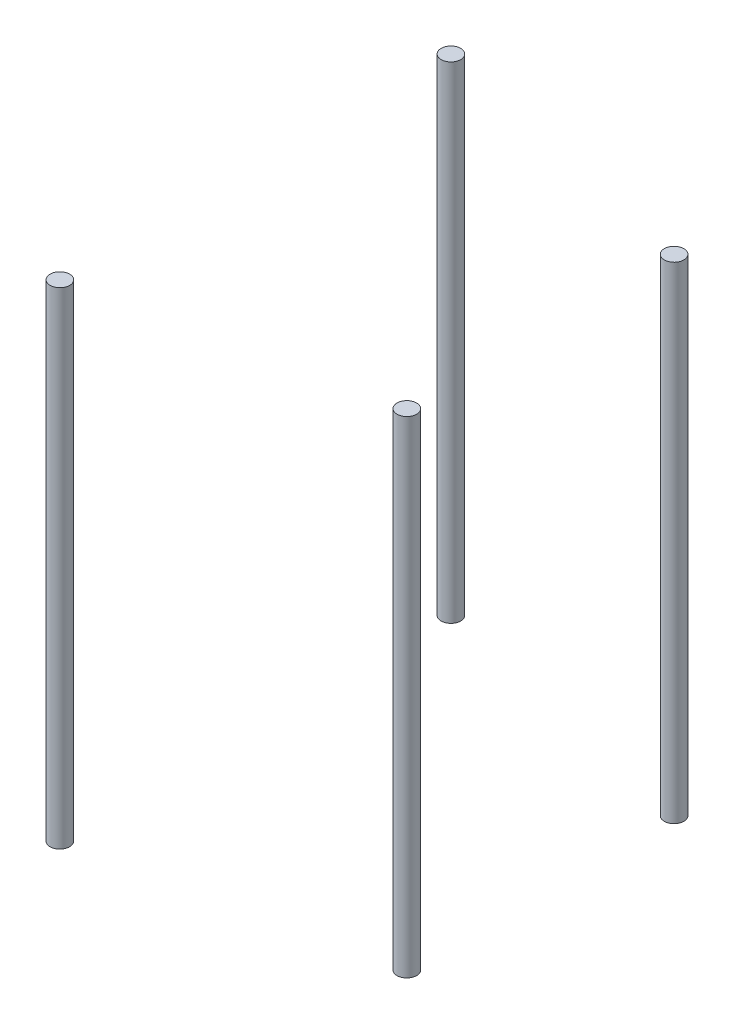
ISO-10303-21;
HEADER;
FILE_DESCRIPTION(('STEP AP214'),'2;1');
FILE_NAME('part.step','',(''),(''),'','','');
FILE_SCHEMA(('AUTOMOTIVE_DESIGN { 1 0 10303 214 1 1 1 1 }'));
ENDSEC;
DATA;
#1=APPLICATION_CONTEXT('core data for automotive mechanical design processes');
#2=APPLICATION_PROTOCOL_DEFINITION('international standard','automotive_design',2000,#1);
#3=PRODUCT_CONTEXT('',#1,'mechanical');
#4=PRODUCT('Part','Part','',(#3));
#5=PRODUCT_RELATED_PRODUCT_CATEGORY('part','',(#4));
#6=PRODUCT_DEFINITION_FORMATION('','',#4);
#7=PRODUCT_DEFINITION_CONTEXT('part definition',#1,'design');
#8=PRODUCT_DEFINITION('design','',#6,#7);
#9=PRODUCT_DEFINITION_SHAPE('','',#8);
#10=(LENGTH_UNIT() NAMED_UNIT(*) SI_UNIT(.MILLI.,.METRE.));
#11=(NAMED_UNIT(*) PLANE_ANGLE_UNIT() SI_UNIT($,.RADIAN.));
#12=(NAMED_UNIT(*) SI_UNIT($,.STERADIAN.) SOLID_ANGLE_UNIT());
#13=UNCERTAINTY_MEASURE_WITH_UNIT(LENGTH_MEASURE(1.E-05),#10,'distance_accuracy_value','');
#14=(GEOMETRIC_REPRESENTATION_CONTEXT(3) GLOBAL_UNCERTAINTY_ASSIGNED_CONTEXT((#13)) GLOBAL_UNIT_ASSIGNED_CONTEXT((#10,
#11,#12)) REPRESENTATION_CONTEXT('',''));
#15=CARTESIAN_POINT('',(0.,0.,0.));
#16=DIRECTION('',(0.,0.,1.));
#17=DIRECTION('',(1.,0.,0.));
#18=AXIS2_PLACEMENT_3D('',#15,#16,#17);
#19=CARTESIAN_POINT('',(-57.0584339411325,96.4881207871619,-120.034242925511));
#20=DIRECTION('',(-2.02021156986605E-06,-0.99999999999796,0.));
#21=DIRECTION('',(0.99999999999796,-2.02021156986605E-06,0.));
#22=AXIS2_PLACEMENT_3D('',#19,#20,#21);
#23=PLANE('',#22);
#24=CARTESIAN_POINT('',(-57.0584339411325,96.4881207871619,-120.034242925511));
#25=DIRECTION('',(2.02021156986605E-06,0.99999999999796,0.));
#26=DIRECTION('',(0.99999999999796,-2.02021156986605E-06,0.));
#27=AXIS2_PLACEMENT_3D('',#24,#25,#26);
#28=CIRCLE('',#27,5.99999999999999);
#29=CARTESIAN_POINT('',(-51.0584339411447,96.4881086658925,-120.034242925511));
#30=VERTEX_POINT('',#29);
#31=EDGE_CURVE('E48',#30,#30,#28,.T.);
#32=ORIENTED_EDGE('',*,*,#31,.F.);
#33=EDGE_LOOP('',(#32));
#34=FACE_BOUND('',#33,.T.);
#35=ADVANCED_FACE('F41',(#34),#23,.T.);
#36=CARTESIAN_POINT('',(-57.0577965991388,411.970916331757,-120.034242925511));
#37=DIRECTION('',(-2.02021156986605E-06,-0.999999999997959,0.));
#38=DIRECTION('',(0.999999999997959,-2.02021156986605E-06,0.));
#39=AXIS2_PLACEMENT_3D('',#36,#37,#38);
#40=CYLINDRICAL_SURFACE('',#39,5.99999999999999);
#41=CARTESIAN_POINT('',(-57.0578308839803,395.,-120.034242925511));
#42=DIRECTION('',(0.,-1.,0.));
#43=DIRECTION('',(-1.,0.,1.09911685133924E-10));
#44=AXIS2_PLACEMENT_3D('',#41,#42,#43);
#45=ELLIPSE('',#44,6.00000000001223,5.99999999999999);
#46=CARTESIAN_POINT('',(-63.0578308839926,395.,-120.034242924852));
#47=VERTEX_POINT('',#46);
#48=EDGE_CURVE('E11',#47,#47,#45,.T.);
#49=ORIENTED_EDGE('',*,*,#48,.T.);
#50=EDGE_LOOP('',(#49));
#51=FACE_BOUND('',#50,.T.);
#52=ORIENTED_EDGE('',*,*,#31,.T.);
#53=EDGE_LOOP('',(#52));
#54=FACE_BOUND('',#53,.T.);
#55=ADVANCED_FACE('F43',(#51,#54),#40,.T.);
#56=CARTESIAN_POINT('',(7.7,395.,0.));
#57=DIRECTION('',(0.,-1.,0.));
#58=DIRECTION('',(0.,0.,-1.));
#59=AXIS2_PLACEMENT_3D('',#56,#57,#58);
#60=PLANE('',#59);
#61=ORIENTED_EDGE('',*,*,#48,.F.);
#62=EDGE_LOOP('',(#61));
#63=FACE_BOUND('',#62,.T.);
#64=ADVANCED_FACE('F59',(#63),#60,.F.);
#65=CLOSED_SHELL('',(#35,#55,#64));
#66=MANIFOLD_SOLID_BREP('B2',#65);
#67=CARTESIAN_POINT('',(117.964470986455,96.4877672038644,-82.0442620577419));
#68=DIRECTION('',(-2.02021156986605E-06,-0.99999999999796,0.));
#69=DIRECTION('',(0.99999999999796,-2.02021156986605E-06,0.));
#70=AXIS2_PLACEMENT_3D('',#67,#68,#69);
#71=PLANE('',#70);
#72=CARTESIAN_POINT('',(117.964470986455,96.4877672038644,-82.0442620577419));
#73=DIRECTION('',(2.02021156986605E-06,0.99999999999796,0.));
#74=DIRECTION('',(0.99999999999796,-2.02021156986605E-06,0.));
#75=AXIS2_PLACEMENT_3D('',#72,#73,#74);
#76=CIRCLE('',#75,6.00000000000001);
#77=CARTESIAN_POINT('',(123.964470986443,96.487755082595,-82.0442620577419));
#78=VERTEX_POINT('',#77);
#79=EDGE_CURVE('E96',#78,#78,#76,.T.);
#80=ORIENTED_EDGE('',*,*,#79,.F.);
#81=EDGE_LOOP('',(#80));
#82=FACE_BOUND('',#81,.T.);
#83=ADVANCED_FACE('F89',(#82),#71,.T.);
#84=CARTESIAN_POINT('',(117.965108328449,411.97056274846,-82.0442620577419));
#85=DIRECTION('',(-2.02021156986605E-06,-0.999999999997959,0.));
#86=DIRECTION('',(0.999999999997959,-2.02021156986605E-06,0.));
#87=AXIS2_PLACEMENT_3D('',#84,#85,#86);
#88=CYLINDRICAL_SURFACE('',#87,6.00000000000001);
#89=CARTESIAN_POINT('',(117.965074044322,395.,-82.0442620577419));
#90=DIRECTION('',(0.,-1.,0.));
#91=DIRECTION('',(-1.,0.,1.09911685133924E-10));
#92=AXIS2_PLACEMENT_3D('',#89,#90,#91);
#93=ELLIPSE('',#92,6.00000000001226,6.00000000000001);
#94=CARTESIAN_POINT('',(111.965074044309,395.,-82.0442620570824));
#95=VERTEX_POINT('',#94);
#96=EDGE_CURVE('E40',#95,#95,#93,.T.);
#97=ORIENTED_EDGE('',*,*,#96,.T.);
#98=EDGE_LOOP('',(#97));
#99=FACE_BOUND('',#98,.T.);
#100=ORIENTED_EDGE('',*,*,#79,.T.);
#101=EDGE_LOOP('',(#100));
#102=FACE_BOUND('',#101,.T.);
#103=ADVANCED_FACE('F91',(#99,#102),#88,.T.);
#104=CARTESIAN_POINT('',(7.7,395.,0.));
#105=DIRECTION('',(0.,-1.,0.));
#106=DIRECTION('',(0.,0.,-1.));
#107=AXIS2_PLACEMENT_3D('',#104,#105,#106);
#108=PLANE('',#107);
#109=ORIENTED_EDGE('',*,*,#96,.F.);
#110=EDGE_LOOP('',(#109));
#111=FACE_BOUND('',#110,.T.);
#112=ADVANCED_FACE('F107',(#111),#108,.F.);
#113=CLOSED_SHELL('',(#83,#103,#112));
#114=MANIFOLD_SOLID_BREP('B6',#113);
#115=CARTESIAN_POINT('',(117.964470986455,96.4877672038644,82.0442620577419));
#116=DIRECTION('',(2.02021156986605E-06,0.99999999999796,0.));
#117=DIRECTION('',(-0.99999999999796,2.02021156986605E-06,0.));
#118=AXIS2_PLACEMENT_3D('',#115,#116,#117);
#119=PLANE('',#118);
#120=CARTESIAN_POINT('',(117.964470986455,96.4877672038644,82.0442620577419));
#121=DIRECTION('',(2.02021156986605E-06,0.99999999999796,0.));
#122=DIRECTION('',(-0.99999999999796,2.02021156986605E-06,0.));
#123=AXIS2_PLACEMENT_3D('',#120,#121,#122);
#124=CIRCLE('',#123,6.00000000000001);
#125=CARTESIAN_POINT('',(111.964470986468,96.4877793251338,82.0442620577419));
#126=VERTEX_POINT('',#125);
#127=EDGE_CURVE('E143',#126,#126,#124,.T.);
#128=ORIENTED_EDGE('',*,*,#127,.F.);
#129=EDGE_LOOP('',(#128));
#130=FACE_BOUND('',#129,.T.);
#131=ADVANCED_FACE('F136',(#130),#119,.F.);
#132=CARTESIAN_POINT('',(117.965108328449,411.97056274846,82.0442620577419));
#133=DIRECTION('',(-2.02021156986605E-06,-0.999999999997959,0.));
#134=DIRECTION('',(0.999999999997959,-2.02021156986605E-06,0.));
#135=AXIS2_PLACEMENT_3D('',#132,#133,#134);
#136=CYLINDRICAL_SURFACE('',#135,6.00000000000001);
#137=CARTESIAN_POINT('',(117.965074044322,395.,82.0442620577419));
#138=DIRECTION('',(0.,-1.,0.));
#139=DIRECTION('',(-1.,0.,1.09911685133924E-10));
#140=AXIS2_PLACEMENT_3D('',#137,#138,#139);
#141=ELLIPSE('',#140,6.00000000001226,6.00000000000001);
#142=CARTESIAN_POINT('',(111.96507404431,395.,82.0442620584013));
#143=VERTEX_POINT('',#142);
#144=EDGE_CURVE('E88',#143,#143,#141,.T.);
#145=ORIENTED_EDGE('',*,*,#144,.T.);
#146=EDGE_LOOP('',(#145));
#147=FACE_BOUND('',#146,.T.);
#148=ORIENTED_EDGE('',*,*,#127,.T.);
#149=EDGE_LOOP('',(#148));
#150=FACE_BOUND('',#149,.T.);
#151=ADVANCED_FACE('F138',(#147,#150),#136,.T.);
#152=CARTESIAN_POINT('',(7.7,395.,0.));
#153=DIRECTION('',(0.,-1.,0.));
#154=DIRECTION('',(0.,0.,-1.));
#155=AXIS2_PLACEMENT_3D('',#152,#153,#154);
#156=PLANE('',#155);
#157=ORIENTED_EDGE('',*,*,#144,.F.);
#158=EDGE_LOOP('',(#157));
#159=FACE_BOUND('',#158,.T.);
#160=ADVANCED_FACE('F154',(#159),#156,.F.);
#161=CLOSED_SHELL('',(#131,#151,#160));
#162=MANIFOLD_SOLID_BREP('B35',#161);
#163=CARTESIAN_POINT('',(-57.0584339411325,96.4881207871619,120.034242925511));
#164=DIRECTION('',(2.02021156986605E-06,0.99999999999796,0.));
#165=DIRECTION('',(-0.99999999999796,2.02021156986605E-06,0.));
#166=AXIS2_PLACEMENT_3D('',#163,#164,#165);
#167=PLANE('',#166);
#168=CARTESIAN_POINT('',(-57.0584339411325,96.4881207871619,120.034242925511));
#169=DIRECTION('',(2.02021156986605E-06,0.99999999999796,0.));
#170=DIRECTION('',(-0.99999999999796,2.02021156986605E-06,0.));
#171=AXIS2_PLACEMENT_3D('',#168,#169,#170);
#172=CIRCLE('',#171,5.99999999999999);
#173=CARTESIAN_POINT('',(-63.0584339411202,96.4881329084314,120.034242925511));
#174=VERTEX_POINT('',#173);
#175=EDGE_CURVE('E183',#174,#174,#172,.T.);
#176=ORIENTED_EDGE('',*,*,#175,.F.);
#177=EDGE_LOOP('',(#176));
#178=FACE_BOUND('',#177,.T.);
#179=ADVANCED_FACE('F176',(#178),#167,.F.);
#180=CARTESIAN_POINT('',(-57.0577965991389,411.970916331757,120.034242925511));
#181=DIRECTION('',(-2.02021156986605E-06,-0.999999999997959,0.));
#182=DIRECTION('',(0.999999999997959,-2.02021156986605E-06,0.));
#183=AXIS2_PLACEMENT_3D('',#180,#181,#182);
#184=CYLINDRICAL_SURFACE('',#183,5.99999999999999);
#185=CARTESIAN_POINT('',(-57.0578308839804,395.,120.034242925511));
#186=DIRECTION('',(0.,-1.,0.));
#187=DIRECTION('',(-1.,0.,1.09911685133924E-10));
#188=AXIS2_PLACEMENT_3D('',#185,#186,#187);
#189=ELLIPSE('',#188,6.00000000001223,5.99999999999999);
#190=CARTESIAN_POINT('',(-63.0578308839926,395.,120.034242926171));
#191=VERTEX_POINT('',#190);
#192=EDGE_CURVE('E135',#191,#191,#189,.T.);
#193=ORIENTED_EDGE('',*,*,#192,.T.);
#194=EDGE_LOOP('',(#193));
#195=FACE_BOUND('',#194,.T.);
#196=ORIENTED_EDGE('',*,*,#175,.T.);
#197=EDGE_LOOP('',(#196));
#198=FACE_BOUND('',#197,.T.);
#199=ADVANCED_FACE('F178',(#195,#198),#184,.T.);
#200=CARTESIAN_POINT('',(7.7,395.,0.));
#201=DIRECTION('',(0.,-1.,0.));
#202=DIRECTION('',(0.,0.,-1.));
#203=AXIS2_PLACEMENT_3D('',#200,#201,#202);
#204=PLANE('',#203);
#205=ORIENTED_EDGE('',*,*,#192,.F.);
#206=EDGE_LOOP('',(#205));
#207=FACE_BOUND('',#206,.T.);
#208=ADVANCED_FACE('F194',(#207),#204,.F.);
#209=CLOSED_SHELL('',(#179,#199,#208));
#210=MANIFOLD_SOLID_BREP('B83',#209);
#211=ADVANCED_BREP_SHAPE_REPRESENTATION('',(#18,#66,#114,#162,#210),#14);
#212=SHAPE_DEFINITION_REPRESENTATION(#9,#211);
ENDSEC;
END-ISO-10303-21;
